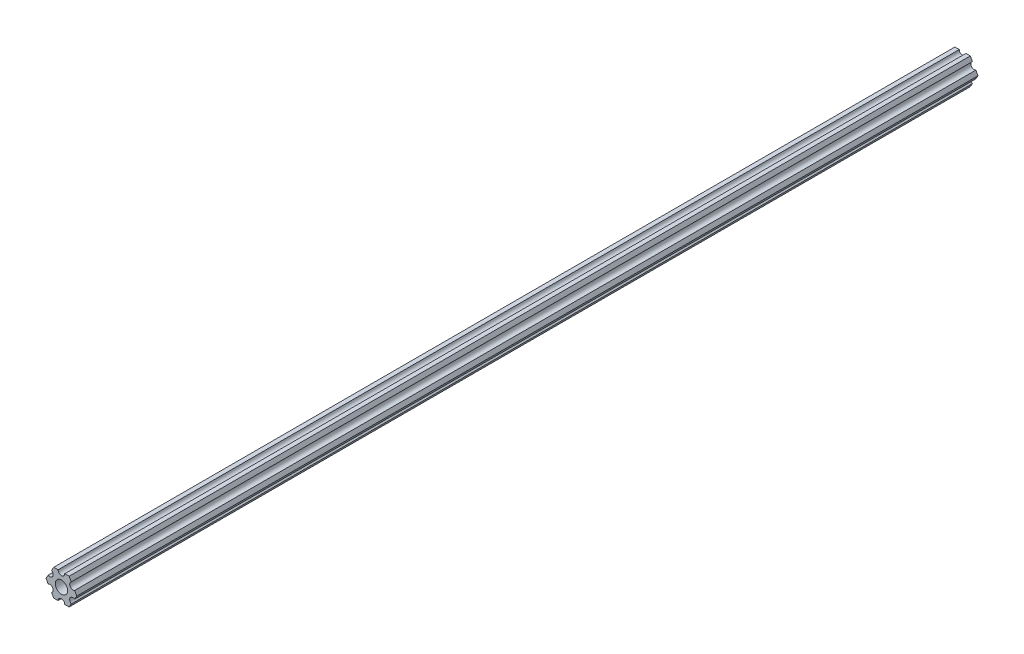
ISO-10303-21;
HEADER;
FILE_DESCRIPTION(('STEP AP214'),'2;1');
FILE_NAME('part.step','',(''),(''),'','','');
FILE_SCHEMA(('AUTOMOTIVE_DESIGN { 1 0 10303 214 1 1 1 1 }'));
ENDSEC;
DATA;
#1=APPLICATION_CONTEXT('core data for automotive mechanical design processes');
#2=APPLICATION_PROTOCOL_DEFINITION('international standard','automotive_design',2000,#1);
#3=PRODUCT_CONTEXT('',#1,'mechanical');
#4=PRODUCT('Part','Part','',(#3));
#5=PRODUCT_RELATED_PRODUCT_CATEGORY('part','',(#4));
#6=PRODUCT_DEFINITION_FORMATION('','',#4);
#7=PRODUCT_DEFINITION_CONTEXT('part definition',#1,'design');
#8=PRODUCT_DEFINITION('design','',#6,#7);
#9=PRODUCT_DEFINITION_SHAPE('','',#8);
#10=(LENGTH_UNIT() NAMED_UNIT(*) SI_UNIT(.MILLI.,.METRE.));
#11=(NAMED_UNIT(*) PLANE_ANGLE_UNIT() SI_UNIT($,.RADIAN.));
#12=(NAMED_UNIT(*) SI_UNIT($,.STERADIAN.) SOLID_ANGLE_UNIT());
#13=UNCERTAINTY_MEASURE_WITH_UNIT(LENGTH_MEASURE(1.E-05),#10,'distance_accuracy_value','');
#14=(GEOMETRIC_REPRESENTATION_CONTEXT(3) GLOBAL_UNCERTAINTY_ASSIGNED_CONTEXT((#13)) GLOBAL_UNIT_ASSIGNED_CONTEXT((#10,
#11,#12)) REPRESENTATION_CONTEXT('',''));
#15=CARTESIAN_POINT('',(0.,0.,0.));
#16=DIRECTION('',(0.,0.,1.));
#17=DIRECTION('',(1.,0.,0.));
#18=AXIS2_PLACEMENT_3D('',#15,#16,#17);
#19=CARTESIAN_POINT('',(6.29301142309098,-1.80018429024546,514.35));
#20=DIRECTION('',(-0.866025434075723,0.499999947533953,0.));
#21=DIRECTION('',(-0.499999947533953,-0.866025434075723,0.));
#22=AXIS2_PLACEMENT_3D('',#19,#20,#21);
#23=PLANE('',#22);
#24=DIRECTION('',(0.499999947533952,0.866025434075723,0.));
#25=VECTOR('',#24,1.);
#26=CARTESIAN_POINT('',(6.29301142309098,-1.80018429024546,428.625));
#27=LINE('',#26,#25);
#28=CARTESIAN_POINT('',(6.29301142309098,-1.80018429024546,428.625));
#29=VERTEX_POINT('',#28);
#30=CARTESIAN_POINT('',(7.33234841870826,4.44212519315656E-07,428.625));
#31=VERTEX_POINT('',#30);
#32=EDGE_CURVE('E347',#29,#31,#27,.T.);
#33=ORIENTED_EDGE('',*,*,#32,.F.);
#34=DIRECTION('',(0.,0.,-1.));
#35=VECTOR('',#34,1.);
#36=CARTESIAN_POINT('',(6.29301142309098,-1.80018429024546,514.35));
#37=LINE('',#36,#35);
#38=CARTESIAN_POINT('',(6.29301142309098,-1.80018429024546,0.));
#39=VERTEX_POINT('',#38);
#40=EDGE_CURVE('E57',#29,#39,#37,.T.);
#41=ORIENTED_EDGE('',*,*,#40,.T.);
#42=DIRECTION('',(0.499999947533953,0.866025434075723,0.));
#43=VECTOR('',#42,1.);
#44=CARTESIAN_POINT('',(6.29301142309098,-1.80018429024546,0.));
#45=LINE('',#44,#43);
#46=CARTESIAN_POINT('',(7.33234841870826,4.44212518961143E-07,0.));
#47=VERTEX_POINT('',#46);
#48=EDGE_CURVE('E40',#39,#47,#45,.T.);
#49=ORIENTED_EDGE('',*,*,#48,.T.);
#50=DIRECTION('',(0.,0.,1.));
#51=VECTOR('',#50,1.);
#52=CARTESIAN_POINT('',(7.33234841870826,4.44212519169686E-07,514.35));
#53=LINE('',#52,#51);
#54=EDGE_CURVE('E219',#47,#31,#53,.T.);
#55=ORIENTED_EDGE('',*,*,#54,.T.);
#56=EDGE_LOOP('',(#33,#41,#49,#55));
#57=FACE_BOUND('',#56,.T.);
#58=ADVANCED_FACE('F32',(#57),#23,.F.);
#59=CARTESIAN_POINT('',(7.33234841870826,4.44212519169686E-07,514.35));
#60=DIRECTION('',(-0.866025373493145,-0.500000052466056,0.));
#61=DIRECTION('',(0.500000052466056,-0.866025373493145,0.));
#62=AXIS2_PLACEMENT_3D('',#59,#60,#61);
#63=PLANE('',#62);
#64=DIRECTION('',(-0.500000052466056,0.866025373493145,0.));
#65=VECTOR('',#64,1.);
#66=CARTESIAN_POINT('',(7.33234841870826,4.44212519315656E-07,428.625));
#67=LINE('',#66,#65);
#68=CARTESIAN_POINT('',(6.29301120497139,1.80018505273895,428.625));
#69=VERTEX_POINT('',#68);
#70=EDGE_CURVE('E346',#31,#69,#67,.T.);
#71=ORIENTED_EDGE('',*,*,#70,.F.);
#72=ORIENTED_EDGE('',*,*,#54,.F.);
#73=DIRECTION('',(-0.500000052466056,0.866025373493145,0.));
#74=VECTOR('',#73,1.);
#75=CARTESIAN_POINT('',(7.33234841870826,4.44212519198905E-07,0.));
#76=LINE('',#75,#74);
#77=CARTESIAN_POINT('',(6.29301120497139,1.80018505273895,0.));
#78=VERTEX_POINT('',#77);
#79=EDGE_CURVE('E259',#47,#78,#76,.T.);
#80=ORIENTED_EDGE('',*,*,#79,.T.);
#81=DIRECTION('',(0.,0.,-1.));
#82=VECTOR('',#81,1.);
#83=CARTESIAN_POINT('',(6.29301120497139,1.80018505273895,514.35));
#84=LINE('',#83,#82);
#85=EDGE_CURVE('E216',#78,#69,#84,.F.);
#86=ORIENTED_EDGE('',*,*,#85,.T.);
#87=EDGE_LOOP('',(#71,#72,#80,#86));
#88=FACE_BOUND('',#87,.T.);
#89=ADVANCED_FACE('F345',(#88),#63,.F.);
#90=CARTESIAN_POINT('',(5.49926112168156,3.17500033315933,514.35));
#91=DIRECTION('',(0.,0.,-1.));
#92=DIRECTION('',(-1.,0.,0.));
#93=AXIS2_PLACEMENT_3D('',#90,#91,#92);
#94=CYLINDRICAL_SURFACE('',#93,1.5875);
#95=CARTESIAN_POINT('',(5.49926112168156,3.17500033315933,428.625));
#96=DIRECTION('',(0.,0.,-1.));
#97=DIRECTION('',(1.,0.,0.));
#98=AXIS2_PLACEMENT_3D('',#95,#96,#97);
#99=CIRCLE('',#98,1.5875);
#100=CARTESIAN_POINT('',(4.70551103839172,4.54981561357972,428.625));
#101=VERTEX_POINT('',#100);
#102=EDGE_CURVE('E390',#69,#101,#99,.T.);
#103=ORIENTED_EDGE('',*,*,#102,.F.);
#104=ORIENTED_EDGE('',*,*,#85,.F.);
#105=CARTESIAN_POINT('',(5.49926112168156,3.17500033315933,0.));
#106=DIRECTION('',(0.,0.,-1.));
#107=DIRECTION('',(-1.,0.,0.));
#108=AXIS2_PLACEMENT_3D('',#105,#106,#107);
#109=CIRCLE('',#108,1.5875);
#110=CARTESIAN_POINT('',(4.70551103839172,4.54981561357972,0.));
#111=VERTEX_POINT('',#110);
#112=EDGE_CURVE('E35',#78,#111,#109,.T.);
#113=ORIENTED_EDGE('',*,*,#112,.T.);
#114=DIRECTION('',(0.,0.,1.));
#115=VECTOR('',#114,1.);
#116=CARTESIAN_POINT('',(4.70551103839172,4.54981561357972,514.35));
#117=LINE('',#116,#115);
#118=EDGE_CURVE('E212',#111,#101,#117,.T.);
#119=ORIENTED_EDGE('',*,*,#118,.T.);
#120=EDGE_LOOP('',(#103,#104,#113,#119));
#121=FACE_BOUND('',#120,.T.);
#122=ADVANCED_FACE('F393',(#121),#94,.F.);
#123=CARTESIAN_POINT('',(4.70551103839172,4.54981561357972,514.35));
#124=DIRECTION('',(-0.866025373493151,-0.500000052466046,0.));
#125=DIRECTION('',(0.500000052466046,-0.866025373493151,0.));
#126=AXIS2_PLACEMENT_3D('',#123,#124,#125);
#127=PLANE('',#126);
#128=DIRECTION('',(-0.500000052466045,0.866025373493151,0.));
#129=VECTOR('',#128,1.);
#130=CARTESIAN_POINT('',(4.70551103839172,4.54981561357972,428.625));
#131=LINE('',#130,#129);
#132=CARTESIAN_POINT('',(3.66617382465481,6.35000022210627,428.625));
#133=VERTEX_POINT('',#132);
#134=EDGE_CURVE('E335',#101,#133,#131,.T.);
#135=ORIENTED_EDGE('',*,*,#134,.F.);
#136=ORIENTED_EDGE('',*,*,#118,.F.);
#137=DIRECTION('',(-0.500000052466046,0.866025373493151,0.));
#138=VECTOR('',#137,1.);
#139=CARTESIAN_POINT('',(4.70551103839172,4.54981561357972,0.));
#140=LINE('',#139,#138);
#141=CARTESIAN_POINT('',(3.66617382465481,6.35000022210627,-1.11022302462516E-13));
#142=VERTEX_POINT('',#141);
#143=EDGE_CURVE('E248',#111,#142,#140,.T.);
#144=ORIENTED_EDGE('',*,*,#143,.T.);
#145=DIRECTION('',(0.,0.,1.));
#146=VECTOR('',#145,1.);
#147=CARTESIAN_POINT('',(3.66617382465481,6.35000022210627,514.35));
#148=LINE('',#147,#146);
#149=EDGE_CURVE('E107',#142,#133,#148,.T.);
#150=ORIENTED_EDGE('',*,*,#149,.T.);
#151=EDGE_LOOP('',(#135,#136,#144,#150));
#152=FACE_BOUND('',#151,.T.);
#153=ADVANCED_FACE('F339',(#152),#127,.F.);
#154=CARTESIAN_POINT('',(3.66617382465481,6.35000022210627,514.35));
#155=DIRECTION('',(6.05825850611185E-08,-0.999999999999998,0.));
#156=DIRECTION('',(0.999999999999998,6.05825850611185E-08,0.));
#157=AXIS2_PLACEMENT_3D('',#154,#155,#156);
#158=PLANE('',#157);
#159=DIRECTION('',(-1.,-3.02912927391926E-08,0.));
#160=VECTOR('',#159,1.);
#161=CARTESIAN_POINT('',(3.66617382465481,6.35000022210627,428.625));
#162=LINE('',#161,#160);
#163=CARTESIAN_POINT('',(1.58749961530073,6.35000015914054,428.625));
#164=VERTEX_POINT('',#163);
#165=EDGE_CURVE('E332',#133,#164,#162,.T.);
#166=ORIENTED_EDGE('',*,*,#165,.F.);
#167=ORIENTED_EDGE('',*,*,#149,.F.);
#168=DIRECTION('',(1.,0.,0.));
#169=VECTOR('',#168,1.);
#170=CARTESIAN_POINT('',(5.49926112168156,6.35000022210627,0.));
#171=LINE('',#170,#169);
#172=CARTESIAN_POINT('',(1.58749961530073,6.35000015914054,0.));
#173=VERTEX_POINT('',#172);
#174=EDGE_CURVE('E243',#142,#173,#171,.F.);
#175=ORIENTED_EDGE('',*,*,#174,.T.);
#176=DIRECTION('',(0.,0.,-1.));
#177=VECTOR('',#176,1.);
#178=CARTESIAN_POINT('',(1.58749961530074,6.35000009617482,514.35));
#179=LINE('',#178,#177);
#180=EDGE_CURVE('E208',#173,#164,#179,.F.);
#181=ORIENTED_EDGE('',*,*,#180,.T.);
#182=EDGE_LOOP('',(#166,#167,#175,#181));
#183=FACE_BOUND('',#182,.T.);
#184=ADVANCED_FACE('F334',(#183),#158,.F.);
#185=CARTESIAN_POINT('',(-3.84699260060323E-07,6.35,514.35));
#186=DIRECTION('',(0.,0.,-1.));
#187=DIRECTION('',(-1.,0.,0.));
#188=AXIS2_PLACEMENT_3D('',#185,#186,#187);
#189=CYLINDRICAL_SURFACE('',#188,1.5875);
#190=CARTESIAN_POINT('',(-3.84699260060323E-07,6.35,428.625));
#191=DIRECTION('',(0.,0.,-1.));
#192=DIRECTION('',(1.,0.,0.));
#193=AXIS2_PLACEMENT_3D('',#190,#191,#192);
#194=CIRCLE('',#193,1.5875);
#195=CARTESIAN_POINT('',(-1.58750038469926,6.34999990382519,428.625));
#196=VERTEX_POINT('',#195);
#197=EDGE_CURVE('E331',#164,#196,#194,.T.);
#198=ORIENTED_EDGE('',*,*,#197,.F.);
#199=ORIENTED_EDGE('',*,*,#180,.F.);
#200=CARTESIAN_POINT('',(-3.84699260060323E-07,6.35,0.));
#201=DIRECTION('',(0.,0.,-1.));
#202=DIRECTION('',(-1.,0.,0.));
#203=AXIS2_PLACEMENT_3D('',#200,#201,#202);
#204=CIRCLE('',#203,1.5875);
#205=CARTESIAN_POINT('',(-1.58750038469926,6.34999990382518,0.));
#206=VERTEX_POINT('',#205);
#207=EDGE_CURVE('E240',#173,#206,#204,.T.);
#208=ORIENTED_EDGE('',*,*,#207,.T.);
#209=DIRECTION('',(0.,0.,1.));
#210=VECTOR('',#209,1.);
#211=CARTESIAN_POINT('',(-1.58750038469926,6.34999990382518,514.35));
#212=LINE('',#211,#210);
#213=EDGE_CURVE('E203',#206,#196,#212,.T.);
#214=ORIENTED_EDGE('',*,*,#213,.T.);
#215=EDGE_LOOP('',(#198,#199,#208,#214));
#216=FACE_BOUND('',#215,.T.);
#217=ADVANCED_FACE('F330',(#216),#189,.F.);
#218=CARTESIAN_POINT('',(-1.58750038469926,6.34999990382518,514.35));
#219=DIRECTION('',(6.05825963273174E-08,-0.999999999999998,0.));
#220=DIRECTION('',(0.999999999999998,6.05825963273174E-08,0.));
#221=AXIS2_PLACEMENT_3D('',#218,#219,#220);
#222=PLANE('',#221);
#223=DIRECTION('',(-1.,-2.0194198968488E-08,0.));
#224=VECTOR('',#223,1.);
#225=CARTESIAN_POINT('',(-1.58750038469926,6.34999990382518,428.625));
#226=LINE('',#225,#224);
#227=CARTESIAN_POINT('',(-3.66617454558244,6.34999986184803,428.625));
#228=VERTEX_POINT('',#227);
#229=EDGE_CURVE('E328',#196,#228,#226,.T.);
#230=ORIENTED_EDGE('',*,*,#229,.F.);
#231=ORIENTED_EDGE('',*,*,#213,.F.);
#232=DIRECTION('',(1.,0.,0.));
#233=VECTOR('',#232,1.);
#234=CARTESIAN_POINT('',(5.49926112168156,6.34999990382518,0.));
#235=LINE('',#234,#233);
#236=CARTESIAN_POINT('',(-3.66617454558244,6.34999986184803,-1.11022302462516E-13));
#237=VERTEX_POINT('',#236);
#238=EDGE_CURVE('E242',#206,#237,#235,.F.);
#239=ORIENTED_EDGE('',*,*,#238,.T.);
#240=DIRECTION('',(0.,0.,1.));
#241=VECTOR('',#240,1.);
#242=CARTESIAN_POINT('',(-3.66617459405349,6.3499997778937,514.35));
#243=LINE('',#242,#241);
#244=EDGE_CURVE('E196',#237,#228,#243,.T.);
#245=ORIENTED_EDGE('',*,*,#244,.T.);
#246=EDGE_LOOP('',(#230,#231,#239,#245));
#247=FACE_BOUND('',#246,.T.);
#248=ADVANCED_FACE('F327',(#247),#222,.F.);
#249=CARTESIAN_POINT('',(-3.66617459405349,6.3499997778937,514.35));
#250=DIRECTION('',(0.866025434075729,-0.499999947533942,0.));
#251=DIRECTION('',(0.499999947533942,0.866025434075729,0.));
#252=AXIS2_PLACEMENT_3D('',#249,#250,#251);
#253=PLANE('',#252);
#254=DIRECTION('',(-0.499999947533942,-0.866025434075729,0.));
#255=VECTOR('',#254,1.);
#256=CARTESIAN_POINT('',(-3.66617454558244,6.34999986184803,428.625));
#257=LINE('',#256,#255);
#258=CARTESIAN_POINT('',(-4.70551158967065,4.54981504343587,428.625));
#259=VERTEX_POINT('',#258);
#260=EDGE_CURVE('E173',#228,#259,#257,.T.);
#261=ORIENTED_EDGE('',*,*,#260,.F.);
#262=ORIENTED_EDGE('',*,*,#244,.F.);
#263=DIRECTION('',(-0.499999947533943,-0.866025434075729,0.));
#264=VECTOR('',#263,1.);
#265=CARTESIAN_POINT('',(-3.66617459405349,6.3499997778937,0.));
#266=LINE('',#265,#264);
#267=CARTESIAN_POINT('',(-4.70551158967065,4.54981504343587,0.));
#268=VERTEX_POINT('',#267);
#269=EDGE_CURVE('E239',#237,#268,#266,.T.);
#270=ORIENTED_EDGE('',*,*,#269,.T.);
#271=DIRECTION('',(0.,0.,-1.));
#272=VECTOR('',#271,1.);
#273=CARTESIAN_POINT('',(-4.70551158967065,4.54981504343587,514.35));
#274=LINE('',#273,#272);
#275=EDGE_CURVE('E192',#268,#259,#274,.F.);
#276=ORIENTED_EDGE('',*,*,#275,.T.);
#277=EDGE_LOOP('',(#261,#262,#270,#276));
#278=FACE_BOUND('',#277,.T.);
#279=ADVANCED_FACE('F323',(#278),#253,.F.);
#280=CARTESIAN_POINT('',(-5.49926150638082,3.17499966684067,514.35));
#281=DIRECTION('',(0.,0.,-1.));
#282=DIRECTION('',(-1.,0.,0.));
#283=AXIS2_PLACEMENT_3D('',#280,#281,#282);
#284=CYLINDRICAL_SURFACE('',#283,1.5875);
#285=CARTESIAN_POINT('',(-5.49926150638082,3.17499966684067,428.625));
#286=DIRECTION('',(0.,0.,-1.));
#287=DIRECTION('',(1.,0.,0.));
#288=AXIS2_PLACEMENT_3D('',#285,#286,#287);
#289=CIRCLE('',#288,1.5875);
#290=CARTESIAN_POINT('',(-6.29301142309098,1.80018429024547,428.625));
#291=VERTEX_POINT('',#290);
#292=EDGE_CURVE('E167',#259,#291,#289,.T.);
#293=ORIENTED_EDGE('',*,*,#292,.F.);
#294=ORIENTED_EDGE('',*,*,#275,.F.);
#295=CARTESIAN_POINT('',(-5.49926150638082,3.17499966684067,0.));
#296=DIRECTION('',(0.,0.,-1.));
#297=DIRECTION('',(-1.,0.,0.));
#298=AXIS2_PLACEMENT_3D('',#295,#296,#297);
#299=CIRCLE('',#298,1.5875);
#300=CARTESIAN_POINT('',(-6.29301142309098,1.80018429024547,0.));
#301=VERTEX_POINT('',#300);
#302=EDGE_CURVE('E191',#268,#301,#299,.T.);
#303=ORIENTED_EDGE('',*,*,#302,.T.);
#304=DIRECTION('',(0.,0.,1.));
#305=VECTOR('',#304,1.);
#306=CARTESIAN_POINT('',(-6.29301142309098,1.80018429024547,514.35));
#307=LINE('',#306,#305);
#308=EDGE_CURVE('E183',#301,#291,#307,.T.);
#309=ORIENTED_EDGE('',*,*,#308,.T.);
#310=EDGE_LOOP('',(#293,#294,#303,#309));
#311=FACE_BOUND('',#310,.T.);
#312=ADVANCED_FACE('F189',(#311),#284,.F.);
#313=CARTESIAN_POINT('',(-6.29301142309098,1.80018429024547,514.35));
#314=DIRECTION('',(0.866025434075724,-0.499999947533951,0.));
#315=DIRECTION('',(0.499999947533951,0.866025434075724,0.));
#316=AXIS2_PLACEMENT_3D('',#313,#314,#315);
#317=PLANE('',#316);
#318=DIRECTION('',(-0.499999947533951,-0.866025434075724,0.));
#319=VECTOR('',#318,1.);
#320=CARTESIAN_POINT('',(-6.29301142309098,1.80018429024547,428.625));
#321=LINE('',#320,#319);
#322=CARTESIAN_POINT('',(-7.33234841870826,-4.44212524036367E-07,428.625));
#323=VERTEX_POINT('',#322);
#324=EDGE_CURVE('E170',#291,#323,#321,.T.);
#325=ORIENTED_EDGE('',*,*,#324,.F.);
#326=ORIENTED_EDGE('',*,*,#308,.F.);
#327=DIRECTION('',(-0.499999947533952,-0.866025434075724,0.));
#328=VECTOR('',#327,1.);
#329=CARTESIAN_POINT('',(-6.29301142309098,1.80018429024547,0.));
#330=LINE('',#329,#328);
#331=CARTESIAN_POINT('',(-7.33234841870826,-4.44212524036367E-07,0.));
#332=VERTEX_POINT('',#331);
#333=EDGE_CURVE('E238',#301,#332,#330,.T.);
#334=ORIENTED_EDGE('',*,*,#333,.T.);
#335=DIRECTION('',(0.,0.,1.));
#336=VECTOR('',#335,1.);
#337=CARTESIAN_POINT('',(-7.33234841870826,-4.44212523790841E-07,514.35));
#338=LINE('',#337,#336);
#339=EDGE_CURVE('E185',#332,#323,#338,.T.);
#340=ORIENTED_EDGE('',*,*,#339,.T.);
#341=EDGE_LOOP('',(#325,#326,#334,#340));
#342=FACE_BOUND('',#341,.T.);
#343=ADVANCED_FACE('F181',(#342),#317,.F.);
#344=CARTESIAN_POINT('',(-7.33234841870826,-4.44212523790841E-07,514.35));
#345=DIRECTION('',(0.866025373493151,0.500000052466045,0.));
#346=DIRECTION('',(-0.500000052466045,0.866025373493151,0.));
#347=AXIS2_PLACEMENT_3D('',#344,#345,#346);
#348=PLANE('',#347);
#349=DIRECTION('',(0.500000052466045,-0.866025373493151,0.));
#350=VECTOR('',#349,1.);
#351=CARTESIAN_POINT('',(-7.33234841870826,-4.44212524036367E-07,428.625));
#352=LINE('',#351,#350);
#353=CARTESIAN_POINT('',(-6.29301120497141,-1.80018505273896,428.625));
#354=VERTEX_POINT('',#353);
#355=EDGE_CURVE('E186',#323,#354,#352,.T.);
#356=ORIENTED_EDGE('',*,*,#355,.F.);
#357=ORIENTED_EDGE('',*,*,#339,.F.);
#358=DIRECTION('',(0.500000052466045,-0.866025373493151,0.));
#359=VECTOR('',#358,1.);
#360=CARTESIAN_POINT('',(-7.33234841870826,-4.44212523969395E-07,0.));
#361=LINE('',#360,#359);
#362=CARTESIAN_POINT('',(-6.29301120497141,-1.80018505273896,0.));
#363=VERTEX_POINT('',#362);
#364=EDGE_CURVE('E237',#332,#363,#361,.T.);
#365=ORIENTED_EDGE('',*,*,#364,.T.);
#366=DIRECTION('',(0.,0.,-1.));
#367=VECTOR('',#366,1.);
#368=CARTESIAN_POINT('',(-6.29301120497141,-1.80018505273896,514.35));
#369=LINE('',#368,#367);
#370=EDGE_CURVE('E194',#363,#354,#369,.F.);
#371=ORIENTED_EDGE('',*,*,#370,.T.);
#372=EDGE_LOOP('',(#356,#357,#365,#371));
#373=FACE_BOUND('',#372,.T.);
#374=ADVANCED_FACE('F289',(#373),#348,.F.);
#375=CARTESIAN_POINT('',(-5.49926112168156,-3.17500033315934,514.35));
#376=DIRECTION('',(0.,0.,-1.));
#377=DIRECTION('',(-1.,0.,0.));
#378=AXIS2_PLACEMENT_3D('',#375,#376,#377);
#379=CYLINDRICAL_SURFACE('',#378,1.5875);
#380=CARTESIAN_POINT('',(-5.49926112168156,-3.17500033315934,428.625));
#381=DIRECTION('',(0.,0.,-1.));
#382=DIRECTION('',(1.,0.,0.));
#383=AXIS2_PLACEMENT_3D('',#380,#381,#382);
#384=CIRCLE('',#383,1.5875);
#385=CARTESIAN_POINT('',(-4.70551103839172,-4.54981561357972,428.625));
#386=VERTEX_POINT('',#385);
#387=EDGE_CURVE('E295',#354,#386,#384,.T.);
#388=ORIENTED_EDGE('',*,*,#387,.F.);
#389=ORIENTED_EDGE('',*,*,#370,.F.);
#390=CARTESIAN_POINT('',(-5.49926112168156,-3.17500033315934,0.));
#391=DIRECTION('',(0.,0.,-1.));
#392=DIRECTION('',(-1.,0.,0.));
#393=AXIS2_PLACEMENT_3D('',#390,#391,#392);
#394=CIRCLE('',#393,1.5875);
#395=CARTESIAN_POINT('',(-4.70551103839172,-4.54981561357972,0.));
#396=VERTEX_POINT('',#395);
#397=EDGE_CURVE('E233',#363,#396,#394,.T.);
#398=ORIENTED_EDGE('',*,*,#397,.T.);
#399=DIRECTION('',(0.,0.,1.));
#400=VECTOR('',#399,1.);
#401=CARTESIAN_POINT('',(-4.70551103839172,-4.54981561357972,514.35));
#402=LINE('',#401,#400);
#403=EDGE_CURVE('E281',#396,#386,#402,.T.);
#404=ORIENTED_EDGE('',*,*,#403,.T.);
#405=EDGE_LOOP('',(#388,#389,#398,#404));
#406=FACE_BOUND('',#405,.T.);
#407=ADVANCED_FACE('F294',(#406),#379,.F.);
#408=CARTESIAN_POINT('',(-4.70551103839172,-4.54981561357972,514.35));
#409=DIRECTION('',(0.866025373493151,0.500000052466045,0.));
#410=DIRECTION('',(-0.500000052466045,0.866025373493151,0.));
#411=AXIS2_PLACEMENT_3D('',#408,#409,#410);
#412=PLANE('',#411);
#413=DIRECTION('',(0.500000052466045,-0.866025373493151,0.));
#414=VECTOR('',#413,1.);
#415=CARTESIAN_POINT('',(-4.70551103839172,-4.54981561357972,428.625));
#416=LINE('',#415,#414);
#417=CARTESIAN_POINT('',(-3.6661738246548,-6.35000022210628,428.625));
#418=VERTEX_POINT('',#417);
#419=EDGE_CURVE('E376',#386,#418,#416,.T.);
#420=ORIENTED_EDGE('',*,*,#419,.F.);
#421=ORIENTED_EDGE('',*,*,#403,.F.);
#422=DIRECTION('',(0.500000052466045,-0.866025373493151,0.));
#423=VECTOR('',#422,1.);
#424=CARTESIAN_POINT('',(-4.70551103839172,-4.54981561357972,0.));
#425=LINE('',#424,#423);
#426=CARTESIAN_POINT('',(-3.6661738246548,-6.35000022210628,-1.11022302462516E-13));
#427=VERTEX_POINT('',#426);
#428=EDGE_CURVE('E236',#396,#427,#425,.T.);
#429=ORIENTED_EDGE('',*,*,#428,.T.);
#430=DIRECTION('',(0.,0.,1.));
#431=VECTOR('',#430,1.);
#432=CARTESIAN_POINT('',(-3.66617382465481,-6.35000022210628,514.35));
#433=LINE('',#432,#431);
#434=EDGE_CURVE('E278',#427,#418,#433,.T.);
#435=ORIENTED_EDGE('',*,*,#434,.T.);
#436=EDGE_LOOP('',(#420,#421,#429,#435));
#437=FACE_BOUND('',#436,.T.);
#438=ADVANCED_FACE('F375',(#437),#412,.F.);
#439=CARTESIAN_POINT('',(-3.66617382465481,-6.35000022210628,514.35));
#440=DIRECTION('',(-6.05825854783851E-08,0.999999999999998,0.));
#441=DIRECTION('',(-0.999999999999998,-6.05825854783851E-08,0.));
#442=AXIS2_PLACEMENT_3D('',#439,#440,#441);
#443=PLANE('',#442);
#444=DIRECTION('',(0.999999999999998,5.34249835485697E-08,0.));
#445=VECTOR('',#444,1.);
#446=CARTESIAN_POINT('',(-3.6661738246548,-6.35000022210628,428.625));
#447=LINE('',#446,#445);
#448=CARTESIAN_POINT('',(-1.58749961530073,-6.35000011105314,428.625));
#449=VERTEX_POINT('',#448);
#450=EDGE_CURVE('E373',#418,#449,#447,.T.);
#451=ORIENTED_EDGE('',*,*,#450,.F.);
#452=ORIENTED_EDGE('',*,*,#434,.F.);
#453=DIRECTION('',(1.,0.,0.));
#454=VECTOR('',#453,1.);
#455=CARTESIAN_POINT('',(5.49926112168156,-6.35000022210628,0.));
#456=LINE('',#455,#454);
#457=CARTESIAN_POINT('',(-1.58749961530073,-6.35000011105314,0.));
#458=VERTEX_POINT('',#457);
#459=EDGE_CURVE('E232',#427,#458,#456,.T.);
#460=ORIENTED_EDGE('',*,*,#459,.T.);
#461=DIRECTION('',(0.,0.,-1.));
#462=VECTOR('',#461,1.);
#463=CARTESIAN_POINT('',(-1.58749961530074,-6.35,514.35));
#464=LINE('',#463,#462);
#465=EDGE_CURVE('E275',#458,#449,#464,.F.);
#466=ORIENTED_EDGE('',*,*,#465,.T.);
#467=EDGE_LOOP('',(#451,#452,#460,#466));
#468=FACE_BOUND('',#467,.T.);
#469=ADVANCED_FACE('F372',(#468),#443,.F.);
#470=CARTESIAN_POINT('',(3.8469926204343E-07,-6.35,514.35));
#471=DIRECTION('',(0.,0.,-1.));
#472=DIRECTION('',(-1.,0.,0.));
#473=AXIS2_PLACEMENT_3D('',#470,#471,#472);
#474=CYLINDRICAL_SURFACE('',#473,1.5875);
#475=CARTESIAN_POINT('',(3.8469926204343E-07,-6.35,428.625));
#476=DIRECTION('',(0.,0.,-1.));
#477=DIRECTION('',(1.,0.,0.));
#478=AXIS2_PLACEMENT_3D('',#475,#476,#477);
#479=CIRCLE('',#478,1.5875);
#480=CARTESIAN_POINT('',(1.58750038469926,-6.34999990382518,428.625));
#481=VERTEX_POINT('',#480);
#482=EDGE_CURVE('E369',#449,#481,#479,.T.);
#483=ORIENTED_EDGE('',*,*,#482,.F.);
#484=ORIENTED_EDGE('',*,*,#465,.F.);
#485=CARTESIAN_POINT('',(3.8469926204343E-07,-6.35,0.));
#486=DIRECTION('',(0.,0.,-1.));
#487=DIRECTION('',(-1.,0.,0.));
#488=AXIS2_PLACEMENT_3D('',#485,#486,#487);
#489=CIRCLE('',#488,1.5875);
#490=CARTESIAN_POINT('',(1.58750038469926,-6.34999990382518,0.));
#491=VERTEX_POINT('',#490);
#492=EDGE_CURVE('E228',#458,#491,#489,.T.);
#493=ORIENTED_EDGE('',*,*,#492,.T.);
#494=DIRECTION('',(0.,0.,1.));
#495=VECTOR('',#494,1.);
#496=CARTESIAN_POINT('',(1.58750038469926,-6.34999990382518,514.35));
#497=LINE('',#496,#495);
#498=EDGE_CURVE('E270',#491,#481,#497,.T.);
#499=ORIENTED_EDGE('',*,*,#498,.T.);
#500=EDGE_LOOP('',(#483,#484,#493,#499));
#501=FACE_BOUND('',#500,.T.);
#502=ADVANCED_FACE('F368',(#501),#474,.F.);
#503=CARTESIAN_POINT('',(1.58750038469926,-6.34999990382518,514.35));
#504=DIRECTION('',(-6.05825721258438E-08,0.999999999999998,0.));
#505=DIRECTION('',(-0.999999999999998,-6.05825721258438E-08,0.));
#506=AXIS2_PLACEMENT_3D('',#503,#504,#505);
#507=PLANE('',#506);
#508=DIRECTION('',(1.,2.01941910404187E-08,0.));
#509=VECTOR('',#508,1.);
#510=CARTESIAN_POINT('',(1.58750038469926,-6.34999990382518,428.625));
#511=LINE('',#510,#509);
#512=CARTESIAN_POINT('',(3.66617454558244,-6.34999986184804,428.625));
#513=VERTEX_POINT('',#512);
#514=EDGE_CURVE('E383',#481,#513,#511,.T.);
#515=ORIENTED_EDGE('',*,*,#514,.F.);
#516=ORIENTED_EDGE('',*,*,#498,.F.);
#517=DIRECTION('',(1.,0.,0.));
#518=VECTOR('',#517,1.);
#519=CARTESIAN_POINT('',(5.49926112168156,-6.34999990382518,0.));
#520=LINE('',#519,#518);
#521=CARTESIAN_POINT('',(3.66617454558244,-6.34999986184804,-1.11022302462516E-13));
#522=VERTEX_POINT('',#521);
#523=EDGE_CURVE('E231',#491,#522,#520,.T.);
#524=ORIENTED_EDGE('',*,*,#523,.T.);
#525=DIRECTION('',(0.,0.,1.));
#526=VECTOR('',#525,1.);
#527=CARTESIAN_POINT('',(3.66617459405346,-6.34999977789375,514.35));
#528=LINE('',#527,#526);
#529=EDGE_CURVE('E267',#522,#513,#528,.T.);
#530=ORIENTED_EDGE('',*,*,#529,.T.);
#531=EDGE_LOOP('',(#515,#516,#524,#530));
#532=FACE_BOUND('',#531,.T.);
#533=ADVANCED_FACE('F364',(#532),#507,.F.);
#534=CARTESIAN_POINT('',(3.66617459405346,-6.34999977789375,514.35));
#535=DIRECTION('',(-0.86602543407573,0.499999947533941,0.));
#536=DIRECTION('',(-0.499999947533941,-0.86602543407573,0.));
#537=AXIS2_PLACEMENT_3D('',#534,#535,#536);
#538=PLANE('',#537);
#539=DIRECTION('',(0.49999994753394,0.86602543407573,0.));
#540=VECTOR('',#539,1.);
#541=CARTESIAN_POINT('',(3.66617454558244,-6.34999986184804,428.625));
#542=LINE('',#541,#540);
#543=CARTESIAN_POINT('',(4.70551158967065,-4.54981504343587,428.625));
#544=VERTEX_POINT('',#543);
#545=EDGE_CURVE('E48',#513,#544,#542,.T.);
#546=ORIENTED_EDGE('',*,*,#545,.F.);
#547=ORIENTED_EDGE('',*,*,#529,.F.);
#548=DIRECTION('',(0.49999994753394,0.86602543407573,0.));
#549=VECTOR('',#548,1.);
#550=CARTESIAN_POINT('',(3.66617459405346,-6.34999977789376,0.));
#551=LINE('',#550,#549);
#552=CARTESIAN_POINT('',(4.70551158967065,-4.54981504343587,0.));
#553=VERTEX_POINT('',#552);
#554=EDGE_CURVE('E227',#522,#553,#551,.T.);
#555=ORIENTED_EDGE('',*,*,#554,.T.);
#556=DIRECTION('',(0.,0.,1.));
#557=VECTOR('',#556,1.);
#558=CARTESIAN_POINT('',(4.70551158967065,-4.54981504343587,514.35));
#559=LINE('',#558,#557);
#560=EDGE_CURVE('E265',#544,#553,#559,.F.);
#561=ORIENTED_EDGE('',*,*,#560,.F.);
#562=EDGE_LOOP('',(#546,#547,#555,#561));
#563=FACE_BOUND('',#562,.T.);
#564=ADVANCED_FACE('F520',(#563),#538,.F.);
#565=CARTESIAN_POINT('',(5.49926150638082,-3.17499966684067,514.35));
#566=DIRECTION('',(0.,0.,-1.));
#567=DIRECTION('',(-1.,0.,0.));
#568=AXIS2_PLACEMENT_3D('',#565,#566,#567);
#569=CYLINDRICAL_SURFACE('',#568,1.58750000000001);
#570=CARTESIAN_POINT('',(5.49926150638082,-3.17499966684067,428.625));
#571=DIRECTION('',(0.,0.,-1.));
#572=DIRECTION('',(1.,0.,0.));
#573=AXIS2_PLACEMENT_3D('',#570,#571,#572);
#574=CIRCLE('',#573,1.58750000000001);
#575=EDGE_CURVE('E386',#544,#29,#574,.T.);
#576=ORIENTED_EDGE('',*,*,#575,.F.);
#577=ORIENTED_EDGE('',*,*,#560,.T.);
#578=CARTESIAN_POINT('',(5.49926150638082,-3.17499966684067,0.));
#579=DIRECTION('',(0.,0.,-1.));
#580=DIRECTION('',(-1.,0.,0.));
#581=AXIS2_PLACEMENT_3D('',#578,#579,#580);
#582=CIRCLE('',#581,1.58750000000001);
#583=EDGE_CURVE('E224',#553,#39,#582,.T.);
#584=ORIENTED_EDGE('',*,*,#583,.T.);
#585=ORIENTED_EDGE('',*,*,#40,.F.);
#586=EDGE_LOOP('',(#576,#577,#584,#585));
#587=FACE_BOUND('',#586,.T.);
#588=ADVANCED_FACE('F529',(#587),#569,.F.);
#589=CARTESIAN_POINT('',(0.,0.,514.35));
#590=DIRECTION('',(0.,0.,-1.));
#591=DIRECTION('',(-1.,0.,0.));
#592=AXIS2_PLACEMENT_3D('',#589,#590,#591);
#593=CYLINDRICAL_SURFACE('',#592,2.9337);
#594=CARTESIAN_POINT('',(0.,0.,0.));
#595=DIRECTION('',(0.,0.,-1.));
#596=DIRECTION('',(-1.,0.,0.));
#597=AXIS2_PLACEMENT_3D('',#594,#595,#596);
#598=CIRCLE('',#597,2.9337);
#599=CARTESIAN_POINT('',(-2.9337,0.,0.));
#600=VERTEX_POINT('',#599);
#601=EDGE_CURVE('E11',#600,#600,#598,.F.);
#602=ORIENTED_EDGE('',*,*,#601,.F.);
#603=EDGE_LOOP('',(#602));
#604=FACE_BOUND('',#603,.T.);
#605=CARTESIAN_POINT('',(0.,0.,428.625));
#606=DIRECTION('',(0.,0.,1.));
#607=DIRECTION('',(1.,0.,0.));
#608=AXIS2_PLACEMENT_3D('',#605,#606,#607);
#609=CIRCLE('',#608,2.9337);
#610=CARTESIAN_POINT('',(2.9337,0.,428.625));
#611=VERTEX_POINT('',#610);
#612=EDGE_CURVE('E177',#611,#611,#609,.T.);
#613=ORIENTED_EDGE('',*,*,#612,.T.);
#614=EDGE_LOOP('',(#613));
#615=FACE_BOUND('',#614,.T.);
#616=ADVANCED_FACE('F539',(#604,#615),#593,.F.);
#617=CARTESIAN_POINT('',(5.49926112168156,3.17500033315933,0.));
#618=DIRECTION('',(0.,0.,1.));
#619=DIRECTION('',(1.,0.,0.));
#620=AXIS2_PLACEMENT_3D('',#617,#618,#619);
#621=PLANE('',#620);
#622=ORIENTED_EDGE('',*,*,#601,.T.);
#623=EDGE_LOOP('',(#622));
#624=FACE_BOUND('',#623,.T.);
#625=ORIENTED_EDGE('',*,*,#583,.F.);
#626=ORIENTED_EDGE('',*,*,#554,.F.);
#627=ORIENTED_EDGE('',*,*,#523,.F.);
#628=ORIENTED_EDGE('',*,*,#492,.F.);
#629=ORIENTED_EDGE('',*,*,#459,.F.);
#630=ORIENTED_EDGE('',*,*,#428,.F.);
#631=ORIENTED_EDGE('',*,*,#397,.F.);
#632=ORIENTED_EDGE('',*,*,#364,.F.);
#633=ORIENTED_EDGE('',*,*,#333,.F.);
#634=ORIENTED_EDGE('',*,*,#302,.F.);
#635=ORIENTED_EDGE('',*,*,#269,.F.);
#636=ORIENTED_EDGE('',*,*,#238,.F.);
#637=ORIENTED_EDGE('',*,*,#207,.F.);
#638=ORIENTED_EDGE('',*,*,#174,.F.);
#639=ORIENTED_EDGE('',*,*,#143,.F.);
#640=ORIENTED_EDGE('',*,*,#112,.F.);
#641=ORIENTED_EDGE('',*,*,#79,.F.);
#642=ORIENTED_EDGE('',*,*,#48,.F.);
#643=EDGE_LOOP('',(#625,#626,#627,#628,#629,#630,#631,#632,#633,#634,#635,#636,#637,#638,#639,
#640,#641,#642));
#644=FACE_BOUND('',#643,.T.);
#645=ADVANCED_FACE('F299',(#624,#644),#621,.F.);
#646=CARTESIAN_POINT('',(-5.49926150638082,3.17499966684067,428.625));
#647=DIRECTION('',(0.,0.,1.));
#648=DIRECTION('',(1.,0.,0.));
#649=AXIS2_PLACEMENT_3D('',#646,#647,#648);
#650=PLANE('',#649);
#651=ORIENTED_EDGE('',*,*,#612,.F.);
#652=EDGE_LOOP('',(#651));
#653=FACE_BOUND('',#652,.T.);
#654=ORIENTED_EDGE('',*,*,#292,.T.);
#655=ORIENTED_EDGE('',*,*,#324,.T.);
#656=ORIENTED_EDGE('',*,*,#355,.T.);
#657=ORIENTED_EDGE('',*,*,#387,.T.);
#658=ORIENTED_EDGE('',*,*,#419,.T.);
#659=ORIENTED_EDGE('',*,*,#450,.T.);
#660=ORIENTED_EDGE('',*,*,#482,.T.);
#661=ORIENTED_EDGE('',*,*,#514,.T.);
#662=ORIENTED_EDGE('',*,*,#545,.T.);
#663=ORIENTED_EDGE('',*,*,#575,.T.);
#664=ORIENTED_EDGE('',*,*,#32,.T.);
#665=ORIENTED_EDGE('',*,*,#70,.T.);
#666=ORIENTED_EDGE('',*,*,#102,.T.);
#667=ORIENTED_EDGE('',*,*,#134,.T.);
#668=ORIENTED_EDGE('',*,*,#165,.T.);
#669=ORIENTED_EDGE('',*,*,#197,.T.);
#670=ORIENTED_EDGE('',*,*,#229,.T.);
#671=ORIENTED_EDGE('',*,*,#260,.T.);
#672=EDGE_LOOP('',(#654,#655,#656,#657,#658,#659,#660,#661,#662,#663,#664,#665,#666,#667,#668,
#669,#670,#671));
#673=FACE_BOUND('',#672,.T.);
#674=ADVANCED_FACE('F169',(#653,#673),#650,.T.);
#675=CLOSED_SHELL('',(#58,#89,#122,#153,#184,#217,#248,#279,#312,#343,#374,#407,#438,#469,#502,
#533,#564,#588,#616,#645,#674));
#676=MANIFOLD_SOLID_BREP('B2',#675);
#677=ADVANCED_BREP_SHAPE_REPRESENTATION('',(#18,#676),#14);
#678=SHAPE_DEFINITION_REPRESENTATION(#9,#677);
ENDSEC;
END-ISO-10303-21;
